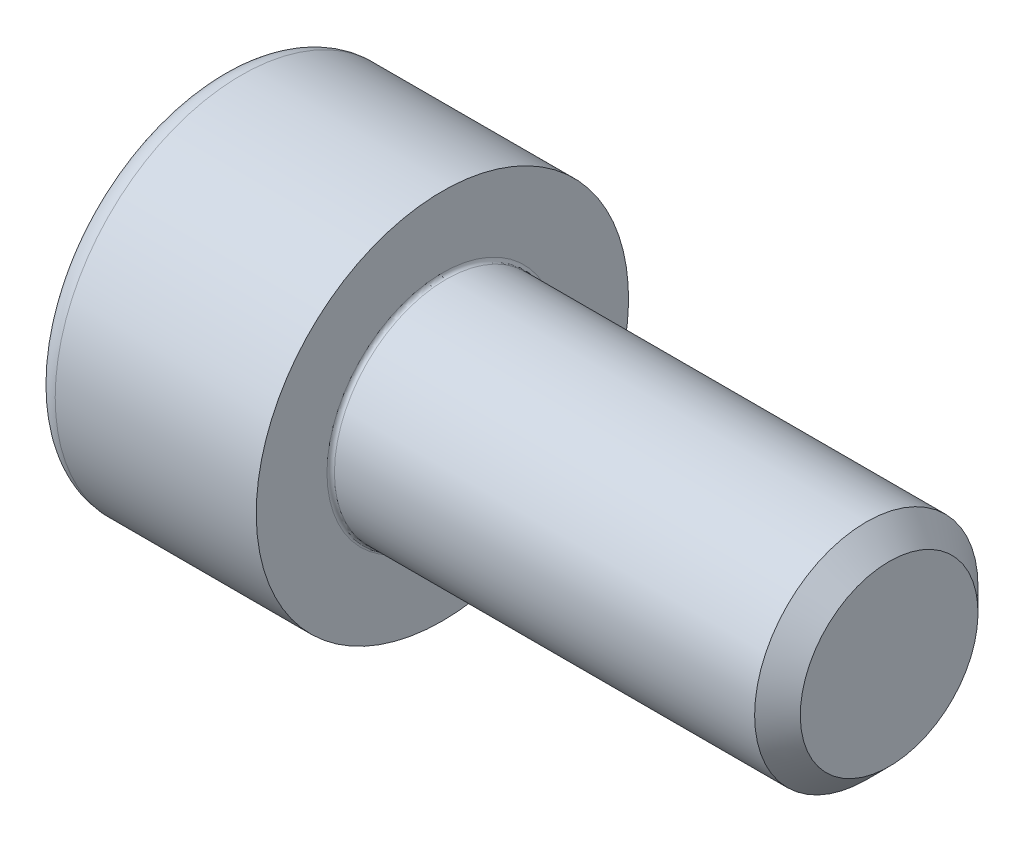
ISO-10303-21;
HEADER;
FILE_DESCRIPTION(('STEP AP214'),'2;1');
FILE_NAME('part.step','',(''),(''),'','','');
FILE_SCHEMA(('AUTOMOTIVE_DESIGN { 1 0 10303 214 1 1 1 1 }'));
ENDSEC;
DATA;
#1=APPLICATION_CONTEXT('core data for automotive mechanical design processes');
#2=APPLICATION_PROTOCOL_DEFINITION('international standard','automotive_design',2000,#1);
#3=PRODUCT_CONTEXT('',#1,'mechanical');
#4=PRODUCT('Part','Part','',(#3));
#5=PRODUCT_RELATED_PRODUCT_CATEGORY('part','',(#4));
#6=PRODUCT_DEFINITION_FORMATION('','',#4);
#7=PRODUCT_DEFINITION_CONTEXT('part definition',#1,'design');
#8=PRODUCT_DEFINITION('design','',#6,#7);
#9=PRODUCT_DEFINITION_SHAPE('','',#8);
#10=(LENGTH_UNIT() NAMED_UNIT(*) SI_UNIT(.MILLI.,.METRE.));
#11=(NAMED_UNIT(*) PLANE_ANGLE_UNIT() SI_UNIT($,.RADIAN.));
#12=(NAMED_UNIT(*) SI_UNIT($,.STERADIAN.) SOLID_ANGLE_UNIT());
#13=UNCERTAINTY_MEASURE_WITH_UNIT(LENGTH_MEASURE(1.E-05),#10,'distance_accuracy_value','');
#14=(GEOMETRIC_REPRESENTATION_CONTEXT(3) GLOBAL_UNCERTAINTY_ASSIGNED_CONTEXT((#13)) GLOBAL_UNIT_ASSIGNED_CONTEXT((#10,
#11,#12)) REPRESENTATION_CONTEXT('',''));
#15=CARTESIAN_POINT('',(0.,0.,0.));
#16=DIRECTION('',(0.,0.,1.));
#17=DIRECTION('',(1.,0.,0.));
#18=AXIS2_PLACEMENT_3D('',#15,#16,#17);
#19=CARTESIAN_POINT('',(-2.16666666666666,0.,0.));
#20=DIRECTION('',(-1.,0.,0.));
#21=DIRECTION('',(0.,1.,0.));
#22=AXIS2_PLACEMENT_3D('',#19,#20,#21);
#23=CONICAL_SURFACE('',#22,1.44337567297406,1.0471975511966);
#24=DIRECTION('',(-0.5,-0.866025403784439,0.));
#25=VECTOR('',#24,1.);
#26=CARTESIAN_POINT('',(-2.16666666666666,-1.44337567297406,0.));
#27=LINE('',#26,#25);
#28=CARTESIAN_POINT('',(-1.33333333333333,0.,0.));
#29=VERTEX_POINT('',#28);
#30=CARTESIAN_POINT('',(-2.77670900630739,-2.5,0.));
#31=VERTEX_POINT('',#30);
#32=EDGE_CURVE('E11',#29,#31,#27,.T.);
#33=ORIENTED_EDGE('',*,*,#32,.T.);
#34=CARTESIAN_POINT('',(-2.77670900630739,-2.5,0.));
#35=CARTESIAN_POINT('',(-2.77670900630739,-2.5,0.669872981077812));
#36=CARTESIAN_POINT('',(-3.,-2.5,1.44337567297407));
#37=(BOUNDED_CURVE() B_SPLINE_CURVE(2,(#34,#35,#36),.UNSPECIFIED.,.F.,
.F.) B_SPLINE_CURVE_WITH_KNOTS((3,3),(0.146054517259741,0.292109034519481),
.UNSPECIFIED.) CURVE() GEOMETRIC_REPRESENTATION_ITEM() RATIONAL_B_SPLINE_CURVE((1.07735026918962,
1.07735026918962,1.)) REPRESENTATION_ITEM(''));
#38=CARTESIAN_POINT('',(-3.,-2.5,1.44337567297406));
#39=VERTEX_POINT('',#38);
#40=EDGE_CURVE('E236',#31,#39,#37,.T.);
#41=ORIENTED_EDGE('',*,*,#40,.T.);
#42=CARTESIAN_POINT('',(-3.,-2.5,1.44337567297406));
#43=CARTESIAN_POINT('',(-2.58333333333333,-1.25,2.1650635094611));
#44=CARTESIAN_POINT('',(-3.,0.,2.88675134594813));
#45=(BOUNDED_CURVE() B_SPLINE_CURVE(2,(#42,#43,#44),.UNSPECIFIED.,.F.,
.F.) B_SPLINE_CURVE_WITH_KNOTS((3,3),(0.,0.292109034519481),
.UNSPECIFIED.) CURVE() GEOMETRIC_REPRESENTATION_ITEM() RATIONAL_B_SPLINE_CURVE((1.,
1.15470053837925,1.)) REPRESENTATION_ITEM(''));
#46=CARTESIAN_POINT('',(-3.,0.,2.88675134594813));
#47=VERTEX_POINT('',#46);
#48=EDGE_CURVE('E28',#39,#47,#45,.T.);
#49=ORIENTED_EDGE('',*,*,#48,.T.);
#50=CARTESIAN_POINT('',(-3.,0.,2.88675134594813));
#51=CARTESIAN_POINT('',(-2.58333333333333,1.25,2.1650635094611));
#52=CARTESIAN_POINT('',(-3.,2.5,1.44337567297406));
#53=(BOUNDED_CURVE() B_SPLINE_CURVE(2,(#50,#51,#52),.UNSPECIFIED.,.F.,
.F.) B_SPLINE_CURVE_WITH_KNOTS((3,3),(0.,0.292109034519481),
.UNSPECIFIED.) CURVE() GEOMETRIC_REPRESENTATION_ITEM() RATIONAL_B_SPLINE_CURVE((1.,
1.15470053837925,1.)) REPRESENTATION_ITEM(''));
#54=CARTESIAN_POINT('',(-3.,2.5,1.44337567297406));
#55=VERTEX_POINT('',#54);
#56=EDGE_CURVE('E193',#47,#55,#53,.T.);
#57=ORIENTED_EDGE('',*,*,#56,.T.);
#58=CARTESIAN_POINT('',(-3.,2.5,1.44337567297407));
#59=CARTESIAN_POINT('',(-2.58333333333333,2.5,0.));
#60=CARTESIAN_POINT('',(-3.,2.5,-1.44337567297407));
#61=(BOUNDED_CURVE() B_SPLINE_CURVE(2,(#58,#59,#60),.UNSPECIFIED.,.F.,
.F.) B_SPLINE_CURVE_WITH_KNOTS((3,3),(0.,0.292109034519481),
.UNSPECIFIED.) CURVE() GEOMETRIC_REPRESENTATION_ITEM() RATIONAL_B_SPLINE_CURVE((1.,
1.15470053837925,1.)) REPRESENTATION_ITEM(''));
#62=CARTESIAN_POINT('',(-3.,2.5,-1.44337567297406));
#63=VERTEX_POINT('',#62);
#64=EDGE_CURVE('E176',#55,#63,#61,.T.);
#65=ORIENTED_EDGE('',*,*,#64,.T.);
#66=CARTESIAN_POINT('',(-3.,2.5,-1.44337567297406));
#67=CARTESIAN_POINT('',(-2.58333333333333,1.25,-2.1650635094611));
#68=CARTESIAN_POINT('',(-3.,0.,-2.88675134594813));
#69=(BOUNDED_CURVE() B_SPLINE_CURVE(2,(#66,#67,#68),.UNSPECIFIED.,.F.,
.F.) B_SPLINE_CURVE_WITH_KNOTS((3,3),(0.,0.292109034519481),
.UNSPECIFIED.) CURVE() GEOMETRIC_REPRESENTATION_ITEM() RATIONAL_B_SPLINE_CURVE((1.,
1.15470053837925,1.)) REPRESENTATION_ITEM(''));
#70=CARTESIAN_POINT('',(-3.,0.,-2.88675134594813));
#71=VERTEX_POINT('',#70);
#72=EDGE_CURVE('E177',#63,#71,#69,.T.);
#73=ORIENTED_EDGE('',*,*,#72,.T.);
#74=CARTESIAN_POINT('',(-3.,0.,-2.88675134594813));
#75=CARTESIAN_POINT('',(-2.58333333333333,-1.25,-2.1650635094611));
#76=CARTESIAN_POINT('',(-3.,-2.5,-1.44337567297406));
#77=(BOUNDED_CURVE() B_SPLINE_CURVE(2,(#74,#75,#76),.UNSPECIFIED.,.F.,
.F.) B_SPLINE_CURVE_WITH_KNOTS((3,3),(0.,0.292109034519481),
.UNSPECIFIED.) CURVE() GEOMETRIC_REPRESENTATION_ITEM() RATIONAL_B_SPLINE_CURVE((1.,
1.15470053837925,1.)) REPRESENTATION_ITEM(''));
#78=CARTESIAN_POINT('',(-3.,-2.5,-1.44337567297406));
#79=VERTEX_POINT('',#78);
#80=EDGE_CURVE('E180',#71,#79,#77,.T.);
#81=ORIENTED_EDGE('',*,*,#80,.T.);
#82=CARTESIAN_POINT('',(-3.,-2.5,-1.44337567297407));
#83=CARTESIAN_POINT('',(-2.77670900630739,-2.5,-0.669872981077812));
#84=CARTESIAN_POINT('',(-2.77670900630739,-2.5,0.));
#85=(BOUNDED_CURVE() B_SPLINE_CURVE(2,(#82,#83,#84),.UNSPECIFIED.,.F.,
.F.) B_SPLINE_CURVE_WITH_KNOTS((3,3),(0.,0.146054517259741),
.UNSPECIFIED.) CURVE() GEOMETRIC_REPRESENTATION_ITEM() RATIONAL_B_SPLINE_CURVE((1.,
1.07735026918962,1.07735026918962)) REPRESENTATION_ITEM(''));
#86=EDGE_CURVE('E192',#79,#31,#85,.T.);
#87=ORIENTED_EDGE('',*,*,#86,.T.);
#88=ORIENTED_EDGE('',*,*,#32,.F.);
#89=EDGE_LOOP('',(#33,#41,#49,#57,#65,#73,#81,#87,#88));
#90=FACE_BOUND('',#89,.T.);
#91=ADVANCED_FACE('F17',(#90),#23,.F.);
#92=CARTESIAN_POINT('',(-6.,-2.5,1.44337567297406));
#93=DIRECTION('',(0.,-0.5,0.866025403784439));
#94=DIRECTION('',(-1.,0.,0.));
#95=AXIS2_PLACEMENT_3D('',#92,#93,#94);
#96=PLANE('',#95);
#97=ORIENTED_EDGE('',*,*,#48,.F.);
#98=DIRECTION('',(-1.,0.,0.));
#99=VECTOR('',#98,1.);
#100=CARTESIAN_POINT('',(-4.5,-2.5,1.44337567297406));
#101=LINE('',#100,#99);
#102=CARTESIAN_POINT('',(-6.,-2.5,1.44337567297406));
#103=VERTEX_POINT('',#102);
#104=EDGE_CURVE('E198',#39,#103,#101,.T.);
#105=ORIENTED_EDGE('',*,*,#104,.T.);
#106=DIRECTION('',(0.,-0.866025403784439,-0.5));
#107=VECTOR('',#106,1.);
#108=CARTESIAN_POINT('',(-6.,-1.875,1.80421959121758));
#109=LINE('',#108,#107);
#110=CARTESIAN_POINT('',(-6.,0.,2.88675134594813));
#111=VERTEX_POINT('',#110);
#112=EDGE_CURVE('E230',#111,#103,#109,.T.);
#113=ORIENTED_EDGE('',*,*,#112,.F.);
#114=DIRECTION('',(1.,0.,0.));
#115=VECTOR('',#114,1.);
#116=CARTESIAN_POINT('',(-4.5,0.,2.88675134594813));
#117=LINE('',#116,#115);
#118=EDGE_CURVE('E80',#111,#47,#117,.T.);
#119=ORIENTED_EDGE('',*,*,#118,.T.);
#120=EDGE_LOOP('',(#97,#105,#113,#119));
#121=FACE_BOUND('',#120,.T.);
#122=ADVANCED_FACE('F301',(#121),#96,.F.);
#123=CARTESIAN_POINT('',(-6.,-2.5,-1.44337567297406));
#124=DIRECTION('',(0.,-1.,0.));
#125=DIRECTION('',(-1.,0.,0.));
#126=AXIS2_PLACEMENT_3D('',#123,#124,#125);
#127=PLANE('',#126);
#128=ORIENTED_EDGE('',*,*,#86,.F.);
#129=DIRECTION('',(-1.,0.,0.));
#130=VECTOR('',#129,1.);
#131=CARTESIAN_POINT('',(-4.5,-2.5,-1.44337567297406));
#132=LINE('',#131,#130);
#133=CARTESIAN_POINT('',(-6.,-2.5,-1.44337567297406));
#134=VERTEX_POINT('',#133);
#135=EDGE_CURVE('E257',#79,#134,#132,.T.);
#136=ORIENTED_EDGE('',*,*,#135,.T.);
#137=DIRECTION('',(0.,0.,-1.));
#138=VECTOR('',#137,1.);
#139=CARTESIAN_POINT('',(-6.,-2.5,-0.721687836487032));
#140=LINE('',#139,#138);
#141=EDGE_CURVE('E226',#103,#134,#140,.T.);
#142=ORIENTED_EDGE('',*,*,#141,.F.);
#143=ORIENTED_EDGE('',*,*,#104,.F.);
#144=ORIENTED_EDGE('',*,*,#40,.F.);
#145=EDGE_LOOP('',(#128,#136,#142,#143,#144));
#146=FACE_BOUND('',#145,.T.);
#147=ADVANCED_FACE('F320',(#146),#127,.F.);
#148=CARTESIAN_POINT('',(-6.,0.,2.88675134594813));
#149=DIRECTION('',(0.,0.5,0.866025403784439));
#150=DIRECTION('',(1.,0.,0.));
#151=AXIS2_PLACEMENT_3D('',#148,#149,#150);
#152=PLANE('',#151);
#153=ORIENTED_EDGE('',*,*,#56,.F.);
#154=ORIENTED_EDGE('',*,*,#118,.F.);
#155=DIRECTION('',(0.,-0.866025403784439,0.5));
#156=VECTOR('',#155,1.);
#157=CARTESIAN_POINT('',(-6.,0.625,2.52590742770461));
#158=LINE('',#157,#156);
#159=CARTESIAN_POINT('',(-6.,2.5,1.44337567297406));
#160=VERTEX_POINT('',#159);
#161=EDGE_CURVE('E167',#160,#111,#158,.T.);
#162=ORIENTED_EDGE('',*,*,#161,.F.);
#163=DIRECTION('',(-1.,0.,0.));
#164=VECTOR('',#163,1.);
#165=CARTESIAN_POINT('',(-4.5,2.5,1.44337567297406));
#166=LINE('',#165,#164);
#167=EDGE_CURVE('E97',#55,#160,#166,.T.);
#168=ORIENTED_EDGE('',*,*,#167,.F.);
#169=EDGE_LOOP('',(#153,#154,#162,#168));
#170=FACE_BOUND('',#169,.T.);
#171=ADVANCED_FACE('F303',(#170),#152,.F.);
#172=CARTESIAN_POINT('',(-6.,2.5,1.44337567297406));
#173=DIRECTION('',(0.,1.,0.));
#174=DIRECTION('',(0.,0.,-1.));
#175=AXIS2_PLACEMENT_3D('',#172,#173,#174);
#176=PLANE('',#175);
#177=ORIENTED_EDGE('',*,*,#64,.F.);
#178=ORIENTED_EDGE('',*,*,#167,.T.);
#179=DIRECTION('',(0.,0.,1.));
#180=VECTOR('',#179,1.);
#181=CARTESIAN_POINT('',(-6.,2.5,0.721687836487031));
#182=LINE('',#181,#180);
#183=CARTESIAN_POINT('',(-6.,2.5,-1.44337567297406));
#184=VERTEX_POINT('',#183);
#185=EDGE_CURVE('E219',#184,#160,#182,.T.);
#186=ORIENTED_EDGE('',*,*,#185,.F.);
#187=DIRECTION('',(-1.,0.,0.));
#188=VECTOR('',#187,1.);
#189=CARTESIAN_POINT('',(-4.5,2.5,-1.44337567297406));
#190=LINE('',#189,#188);
#191=EDGE_CURVE('E173',#63,#184,#190,.T.);
#192=ORIENTED_EDGE('',*,*,#191,.F.);
#193=EDGE_LOOP('',(#177,#178,#186,#192));
#194=FACE_BOUND('',#193,.T.);
#195=ADVANCED_FACE('F306',(#194),#176,.F.);
#196=CARTESIAN_POINT('',(-6.,2.5,-1.44337567297406));
#197=DIRECTION('',(0.,0.5,-0.866025403784439));
#198=DIRECTION('',(-1.,0.,0.));
#199=AXIS2_PLACEMENT_3D('',#196,#197,#198);
#200=PLANE('',#199);
#201=ORIENTED_EDGE('',*,*,#72,.F.);
#202=ORIENTED_EDGE('',*,*,#191,.T.);
#203=DIRECTION('',(0.,0.866025403784439,0.5));
#204=VECTOR('',#203,1.);
#205=CARTESIAN_POINT('',(-6.,1.875,-1.80421959121758));
#206=LINE('',#205,#204);
#207=CARTESIAN_POINT('',(-6.,0.,-2.88675134594813));
#208=VERTEX_POINT('',#207);
#209=EDGE_CURVE('E181',#208,#184,#206,.T.);
#210=ORIENTED_EDGE('',*,*,#209,.F.);
#211=DIRECTION('',(-1.,0.,0.));
#212=VECTOR('',#211,1.);
#213=CARTESIAN_POINT('',(-4.5,0.,-2.88675134594813));
#214=LINE('',#213,#212);
#215=EDGE_CURVE('E213',#71,#208,#214,.T.);
#216=ORIENTED_EDGE('',*,*,#215,.F.);
#217=EDGE_LOOP('',(#201,#202,#210,#216));
#218=FACE_BOUND('',#217,.T.);
#219=ADVANCED_FACE('F312',(#218),#200,.F.);
#220=CARTESIAN_POINT('',(-6.,0.,-2.88675134594813));
#221=DIRECTION('',(0.,-0.5,-0.866025403784439));
#222=DIRECTION('',(0.,-0.866025403784439,0.5));
#223=AXIS2_PLACEMENT_3D('',#220,#221,#222);
#224=PLANE('',#223);
#225=ORIENTED_EDGE('',*,*,#80,.F.);
#226=ORIENTED_EDGE('',*,*,#215,.T.);
#227=DIRECTION('',(0.,0.866025403784439,-0.5));
#228=VECTOR('',#227,1.);
#229=CARTESIAN_POINT('',(-6.,-0.625,-2.52590742770461));
#230=LINE('',#229,#228);
#231=EDGE_CURVE('E21',#134,#208,#230,.T.);
#232=ORIENTED_EDGE('',*,*,#231,.F.);
#233=ORIENTED_EDGE('',*,*,#135,.F.);
#234=EDGE_LOOP('',(#225,#226,#232,#233));
#235=FACE_BOUND('',#234,.T.);
#236=ADVANCED_FACE('F315',(#235),#224,.F.);
#237=CARTESIAN_POINT('',(-3.,0.,0.));
#238=DIRECTION('',(1.,0.,0.));
#239=DIRECTION('',(0.,1.,0.));
#240=AXIS2_PLACEMENT_3D('',#237,#238,#239);
#241=CYLINDRICAL_SURFACE('',#240,5.);
#242=CARTESIAN_POINT('',(0.,0.,0.));
#243=DIRECTION('',(1.,0.,0.));
#244=DIRECTION('',(0.,1.,0.));
#245=AXIS2_PLACEMENT_3D('',#242,#243,#244);
#246=CIRCLE('',#245,5.);
#247=CARTESIAN_POINT('',(0.,-5.,0.));
#248=VERTEX_POINT('',#247);
#249=EDGE_CURVE('E172',#248,#248,#246,.T.);
#250=ORIENTED_EDGE('',*,*,#249,.F.);
#251=DIRECTION('',(-1.,0.,0.));
#252=VECTOR('',#251,1.);
#253=CARTESIAN_POINT('',(-3.,-5.,0.));
#254=LINE('',#253,#252);
#255=CARTESIAN_POINT('',(-5.4,-5.,0.));
#256=VERTEX_POINT('',#255);
#257=EDGE_CURVE('E155',#248,#256,#254,.T.);
#258=ORIENTED_EDGE('',*,*,#257,.T.);
#259=CARTESIAN_POINT('',(-5.4,0.,0.));
#260=DIRECTION('',(-1.,0.,0.));
#261=DIRECTION('',(0.,-1.,0.));
#262=AXIS2_PLACEMENT_3D('',#259,#260,#261);
#263=CIRCLE('',#262,5.);
#264=CARTESIAN_POINT('',(-5.4,0.,5.));
#265=VERTEX_POINT('',#264);
#266=EDGE_CURVE('E143',#265,#256,#263,.T.);
#267=ORIENTED_EDGE('',*,*,#266,.F.);
#268=CARTESIAN_POINT('',(-5.4,0.,0.));
#269=DIRECTION('',(-1.,0.,0.));
#270=DIRECTION('',(0.,-1.,0.));
#271=AXIS2_PLACEMENT_3D('',#268,#269,#270);
#272=CIRCLE('',#271,5.);
#273=EDGE_CURVE('E147',#256,#265,#272,.T.);
#274=ORIENTED_EDGE('',*,*,#273,.F.);
#275=ORIENTED_EDGE('',*,*,#257,.F.);
#276=EDGE_LOOP('',(#250,#258,#267,#274,#275));
#277=FACE_BOUND('',#276,.T.);
#278=ADVANCED_FACE('F154',(#277),#241,.T.);
#279=CARTESIAN_POINT('',(-6.,3.94337567297406,0.));
#280=DIRECTION('',(-1.,0.,0.));
#281=DIRECTION('',(0.,1.,0.));
#282=AXIS2_PLACEMENT_3D('',#279,#280,#281);
#283=PLANE('',#282);
#284=ORIENTED_EDGE('',*,*,#185,.T.);
#285=ORIENTED_EDGE('',*,*,#161,.T.);
#286=ORIENTED_EDGE('',*,*,#112,.T.);
#287=ORIENTED_EDGE('',*,*,#141,.T.);
#288=ORIENTED_EDGE('',*,*,#231,.T.);
#289=ORIENTED_EDGE('',*,*,#209,.T.);
#290=EDGE_LOOP('',(#284,#285,#286,#287,#288,#289));
#291=FACE_BOUND('',#290,.T.);
#292=CARTESIAN_POINT('',(-6.,0.,0.));
#293=DIRECTION('',(1.,0.,0.));
#294=DIRECTION('',(0.,-1.,0.));
#295=AXIS2_PLACEMENT_3D('',#292,#293,#294);
#296=CIRCLE('',#295,4.4);
#297=CARTESIAN_POINT('',(-6.,0.,4.4));
#298=VERTEX_POINT('',#297);
#299=EDGE_CURVE('E145',#298,#298,#296,.T.);
#300=ORIENTED_EDGE('',*,*,#299,.F.);
#301=EDGE_LOOP('',(#300));
#302=FACE_BOUND('',#301,.T.);
#303=ADVANCED_FACE('F318',(#291,#302),#283,.T.);
#304=CARTESIAN_POINT('',(-5.4,0.,0.));
#305=DIRECTION('',(1.,0.,0.));
#306=DIRECTION('',(0.,0.,-1.));
#307=AXIS2_PLACEMENT_3D('',#304,#305,#306);
#308=TOROIDAL_SURFACE('',#307,4.4,0.6);
#309=ORIENTED_EDGE('',*,*,#266,.T.);
#310=ORIENTED_EDGE('',*,*,#273,.T.);
#311=CARTESIAN_POINT('',(-5.4,0.,4.4));
#312=DIRECTION('',(0.,-1.,0.));
#313=DIRECTION('',(0.,0.,1.));
#314=AXIS2_PLACEMENT_3D('',#311,#312,#313);
#315=CIRCLE('',#314,0.6);
#316=EDGE_CURVE('E139',#265,#298,#315,.T.);
#317=ORIENTED_EDGE('',*,*,#316,.T.);
#318=ORIENTED_EDGE('',*,*,#299,.T.);
#319=ORIENTED_EDGE('',*,*,#316,.F.);
#320=EDGE_LOOP('',(#309,#310,#317,#318,#319));
#321=FACE_BOUND('',#320,.T.);
#322=ADVANCED_FACE('F141',(#321),#308,.T.);
#323=CARTESIAN_POINT('',(12.,1.5,0.));
#324=DIRECTION('',(1.,0.,0.));
#325=DIRECTION('',(0.,1.,0.));
#326=AXIS2_PLACEMENT_3D('',#323,#324,#325);
#327=PLANE('',#326);
#328=CARTESIAN_POINT('',(12.,0.,0.));
#329=DIRECTION('',(-1.,0.,0.));
#330=DIRECTION('',(0.,-1.,0.));
#331=AXIS2_PLACEMENT_3D('',#328,#329,#330);
#332=CIRCLE('',#331,2.38655);
#333=CARTESIAN_POINT('',(12.,2.38655,0.));
#334=VERTEX_POINT('',#333);
#335=EDGE_CURVE('E163',#334,#334,#332,.T.);
#336=ORIENTED_EDGE('',*,*,#335,.F.);
#337=EDGE_LOOP('',(#336));
#338=FACE_BOUND('',#337,.T.);
#339=ADVANCED_FACE('F19',(#338),#327,.T.);
#340=CARTESIAN_POINT('',(11.693275,0.,0.));
#341=DIRECTION('',(-1.,0.,0.));
#342=DIRECTION('',(0.,-1.,0.));
#343=AXIS2_PLACEMENT_3D('',#340,#341,#342);
#344=CONICAL_SURFACE('',#343,2.693275,0.785398163397448);
#345=ORIENTED_EDGE('',*,*,#335,.T.);
#346=DIRECTION('',(-0.707106781186548,0.707106781186547,0.));
#347=VECTOR('',#346,1.);
#348=CARTESIAN_POINT('',(11.693275,2.693275,0.));
#349=LINE('',#348,#347);
#350=CARTESIAN_POINT('',(11.38655,3.,0.));
#351=VERTEX_POINT('',#350);
#352=EDGE_CURVE('E157',#334,#351,#349,.T.);
#353=ORIENTED_EDGE('',*,*,#352,.T.);
#354=CARTESIAN_POINT('',(11.38655,0.,0.));
#355=DIRECTION('',(1.,0.,0.));
#356=DIRECTION('',(0.,-1.,0.));
#357=AXIS2_PLACEMENT_3D('',#354,#355,#356);
#358=CIRCLE('',#357,3.);
#359=CARTESIAN_POINT('',(11.38655,-3.,0.));
#360=VERTEX_POINT('',#359);
#361=EDGE_CURVE('E199',#351,#360,#358,.T.);
#362=ORIENTED_EDGE('',*,*,#361,.T.);
#363=CARTESIAN_POINT('',(11.38655,0.,0.));
#364=DIRECTION('',(1.,0.,0.));
#365=DIRECTION('',(0.,-1.,0.));
#366=AXIS2_PLACEMENT_3D('',#363,#364,#365);
#367=CIRCLE('',#366,3.);
#368=EDGE_CURVE('E206',#360,#351,#367,.T.);
#369=ORIENTED_EDGE('',*,*,#368,.T.);
#370=ORIENTED_EDGE('',*,*,#352,.F.);
#371=EDGE_LOOP('',(#345,#353,#362,#369,#370));
#372=FACE_BOUND('',#371,.T.);
#373=ADVANCED_FACE('F341',(#372),#344,.T.);
#374=CARTESIAN_POINT('',(0.,4.,0.));
#375=DIRECTION('',(1.,0.,0.));
#376=DIRECTION('',(0.,1.,0.));
#377=AXIS2_PLACEMENT_3D('',#374,#375,#376);
#378=PLANE('',#377);
#379=CARTESIAN_POINT('',(0.,0.,0.));
#380=DIRECTION('',(1.,0.,0.));
#381=DIRECTION('',(0.,-1.,0.));
#382=AXIS2_PLACEMENT_3D('',#379,#380,#381);
#383=CIRCLE('',#382,3.1);
#384=CARTESIAN_POINT('',(0.,0.,3.1));
#385=VERTEX_POINT('',#384);
#386=EDGE_CURVE('E225',#385,#385,#383,.T.);
#387=ORIENTED_EDGE('',*,*,#386,.F.);
#388=EDGE_LOOP('',(#387));
#389=FACE_BOUND('',#388,.T.);
#390=ORIENTED_EDGE('',*,*,#249,.T.);
#391=EDGE_LOOP('',(#390));
#392=FACE_BOUND('',#391,.T.);
#393=ADVANCED_FACE('F344',(#389,#392),#378,.T.);
#394=CARTESIAN_POINT('',(7.5,0.,0.));
#395=DIRECTION('',(1.,0.,0.));
#396=DIRECTION('',(0.,1.,0.));
#397=AXIS2_PLACEMENT_3D('',#394,#395,#396);
#398=CYLINDRICAL_SURFACE('',#397,3.);
#399=ORIENTED_EDGE('',*,*,#361,.F.);
#400=ORIENTED_EDGE('',*,*,#368,.F.);
#401=DIRECTION('',(-1.,0.,0.));
#402=VECTOR('',#401,1.);
#403=CARTESIAN_POINT('',(7.5,-3.,0.));
#404=LINE('',#403,#402);
#405=CARTESIAN_POINT('',(0.100000000000002,-3.,0.));
#406=VERTEX_POINT('',#405);
#407=EDGE_CURVE('E231',#360,#406,#404,.T.);
#408=ORIENTED_EDGE('',*,*,#407,.T.);
#409=CARTESIAN_POINT('',(0.100000000000002,0.,0.));
#410=DIRECTION('',(-1.,0.,0.));
#411=DIRECTION('',(0.,-1.,0.));
#412=AXIS2_PLACEMENT_3D('',#409,#410,#411);
#413=CIRCLE('',#412,3.);
#414=CARTESIAN_POINT('',(0.100000000000002,0.,3.));
#415=VERTEX_POINT('',#414);
#416=EDGE_CURVE('E224',#415,#406,#413,.T.);
#417=ORIENTED_EDGE('',*,*,#416,.F.);
#418=CARTESIAN_POINT('',(0.100000000000002,0.,0.));
#419=DIRECTION('',(-1.,0.,0.));
#420=DIRECTION('',(0.,-1.,0.));
#421=AXIS2_PLACEMENT_3D('',#418,#419,#420);
#422=CIRCLE('',#421,3.);
#423=EDGE_CURVE('E207',#406,#415,#422,.T.);
#424=ORIENTED_EDGE('',*,*,#423,.F.);
#425=ORIENTED_EDGE('',*,*,#407,.F.);
#426=EDGE_LOOP('',(#399,#400,#408,#417,#424,#425));
#427=FACE_BOUND('',#426,.T.);
#428=ADVANCED_FACE('F346',(#427),#398,.T.);
#429=CARTESIAN_POINT('',(0.100000000000002,0.,0.));
#430=DIRECTION('',(1.,0.,0.));
#431=DIRECTION('',(0.,0.,-1.));
#432=AXIS2_PLACEMENT_3D('',#429,#430,#431);
#433=TOROIDAL_SURFACE('',#432,3.1,0.1);
#434=ORIENTED_EDGE('',*,*,#386,.T.);
#435=CARTESIAN_POINT('',(0.100000000000002,0.,3.1));
#436=DIRECTION('',(0.,-1.,0.));
#437=DIRECTION('',(0.,0.,1.));
#438=AXIS2_PLACEMENT_3D('',#435,#436,#437);
#439=CIRCLE('',#438,0.1);
#440=EDGE_CURVE('E220',#385,#415,#439,.T.);
#441=ORIENTED_EDGE('',*,*,#440,.T.);
#442=ORIENTED_EDGE('',*,*,#416,.T.);
#443=ORIENTED_EDGE('',*,*,#423,.T.);
#444=ORIENTED_EDGE('',*,*,#440,.F.);
#445=EDGE_LOOP('',(#434,#441,#442,#443,#444));
#446=FACE_BOUND('',#445,.T.);
#447=ADVANCED_FACE('F338',(#446),#433,.F.);
#448=CLOSED_SHELL('',(#91,#122,#147,#171,#195,#219,#236,#278,#303,#322,#339,#373,#393,#428,#447));
#449=MANIFOLD_SOLID_BREP('B1',#448);
#450=ADVANCED_BREP_SHAPE_REPRESENTATION('',(#18,#449),#14);
#451=SHAPE_DEFINITION_REPRESENTATION(#9,#450);
ENDSEC;
END-ISO-10303-21;
